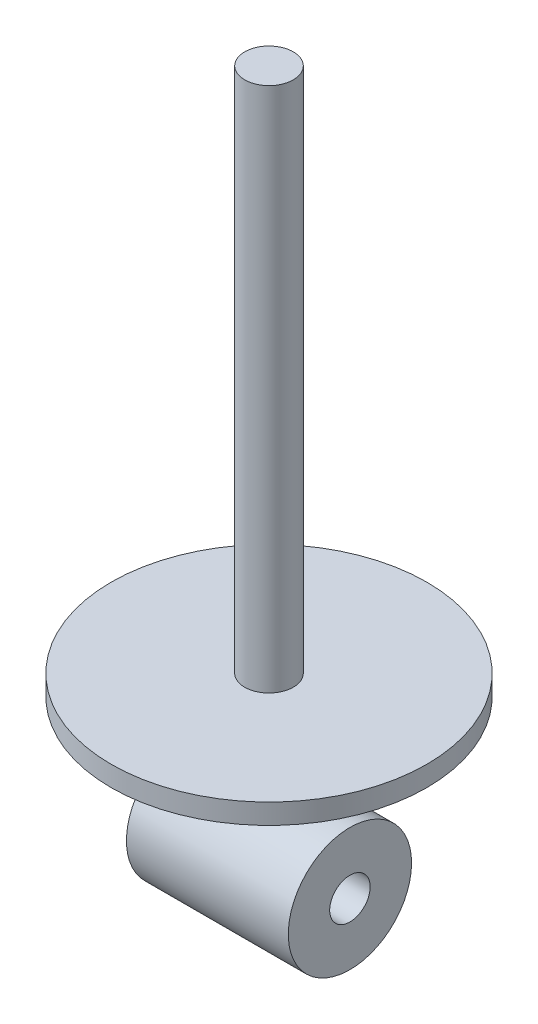
ISO-10303-21;
HEADER;
FILE_DESCRIPTION(('STEP AP214'),'2;1');
FILE_NAME('part.step','',(''),(''),'','','');
FILE_SCHEMA(('AUTOMOTIVE_DESIGN { 1 0 10303 214 1 1 1 1 }'));
ENDSEC;
DATA;
#1=APPLICATION_CONTEXT('core data for automotive mechanical design processes');
#2=APPLICATION_PROTOCOL_DEFINITION('international standard','automotive_design',2000,#1);
#3=PRODUCT_CONTEXT('',#1,'mechanical');
#4=PRODUCT('Part','Part','',(#3));
#5=PRODUCT_RELATED_PRODUCT_CATEGORY('part','',(#4));
#6=PRODUCT_DEFINITION_FORMATION('','',#4);
#7=PRODUCT_DEFINITION_CONTEXT('part definition',#1,'design');
#8=PRODUCT_DEFINITION('design','',#6,#7);
#9=PRODUCT_DEFINITION_SHAPE('','',#8);
#10=(LENGTH_UNIT() NAMED_UNIT(*) SI_UNIT(.MILLI.,.METRE.));
#11=(NAMED_UNIT(*) PLANE_ANGLE_UNIT() SI_UNIT($,.RADIAN.));
#12=(NAMED_UNIT(*) SI_UNIT($,.STERADIAN.) SOLID_ANGLE_UNIT());
#13=UNCERTAINTY_MEASURE_WITH_UNIT(LENGTH_MEASURE(1.E-05),#10,'distance_accuracy_value','');
#14=(GEOMETRIC_REPRESENTATION_CONTEXT(3) GLOBAL_UNCERTAINTY_ASSIGNED_CONTEXT((#13)) GLOBAL_UNIT_ASSIGNED_CONTEXT((#10,
#11,#12)) REPRESENTATION_CONTEXT('',''));
#15=CARTESIAN_POINT('',(0.,0.,0.));
#16=DIRECTION('',(0.,0.,1.));
#17=DIRECTION('',(1.,0.,0.));
#18=AXIS2_PLACEMENT_3D('',#15,#16,#17);
#19=CARTESIAN_POINT('',(0.,-20.,0.));
#20=DIRECTION('',(0.,1.,0.));
#21=DIRECTION('',(0.,0.,1.));
#22=AXIS2_PLACEMENT_3D('',#19,#20,#21);
#23=CYLINDRICAL_SURFACE('',#22,7.5);
#24=CARTESIAN_POINT('',(0.,0.,0.));
#25=DIRECTION('',(0.,-1.,0.));
#26=DIRECTION('',(0.,0.,-1.));
#27=AXIS2_PLACEMENT_3D('',#24,#25,#26);
#28=CIRCLE('',#27,7.5);
#29=CARTESIAN_POINT('',(0.,0.,-7.5));
#30=VERTEX_POINT('',#29);
#31=EDGE_CURVE('E43',#30,#30,#28,.T.);
#32=ORIENTED_EDGE('',*,*,#31,.T.);
#33=EDGE_LOOP('',(#32));
#34=FACE_BOUND('',#33,.T.);
#35=CARTESIAN_POINT('',(0.,-19.9674695696667,7.5));
#36=CARTESIAN_POINT('',(-0.195959488516597,-19.9674681956118,7.49999893072575));
#37=CARTESIAN_POINT('',(-0.391941529981052,-19.9631104142098,7.49230957299577));
#38=CARTESIAN_POINT('',(-0.782404371091417,-19.9458386103406,7.46165016093993));
#39=CARTESIAN_POINT('',(-0.976884396822196,-19.9329204405729,7.43867269987691));
#40=CARTESIAN_POINT('',(-1.36307668322194,-19.8989793225105,7.37768927740854));
#41=CARTESIAN_POINT('',(-1.55478391315212,-19.8779431916632,7.33965886930959));
#42=CARTESIAN_POINT('',(-1.93382272233385,-19.8285066309616,7.24902248845647));
#43=CARTESIAN_POINT('',(-2.1211523675893,-19.8001030108163,7.19641020073815));
#44=CARTESIAN_POINT('',(-2.48913675807943,-19.7370587431624,7.07752532784616));
#45=CARTESIAN_POINT('',(-2.66982334130422,-19.7024543925643,7.01133193106757));
#46=CARTESIAN_POINT('',(-3.02468502130675,-19.6279530734112,6.86572015291843));
#47=CARTESIAN_POINT('',(-3.19885757029247,-19.5880540611739,6.78629666183675));
#48=CARTESIAN_POINT('',(-3.71015035920553,-19.4621188934473,6.52917415078872));
#49=CARTESIAN_POINT('',(-4.03640461959471,-19.3697794798383,6.33250592799593));
#50=CARTESIAN_POINT('',(-4.67854646411312,-19.1698287921517,5.87612163776818));
#51=CARTESIAN_POINT('',(-4.99152677683117,-19.061586824195,5.61262552171513));
#52=CARTESIAN_POINT('',(-5.57125994245701,-18.8470586085634,5.03761092959794));
#53=CARTESIAN_POINT('',(-5.83799032588857,-18.7407733337906,4.72606924978246));
#54=CARTESIAN_POINT('',(-6.20617657602265,-18.5873368864239,4.21677792730242));
#55=CARTESIAN_POINT('',(-6.32665063135823,-18.5357468883586,4.03381863837286));
#56=CARTESIAN_POINT('',(-6.551612830314,-18.4374725970101,3.65710655068989));
#57=CARTESIAN_POINT('',(-6.65610776704691,-18.3907862217355,3.46335838660571));
#58=CARTESIAN_POINT('',(-6.84808769163061,-18.3036669933262,3.06632039776231));
#59=CARTESIAN_POINT('',(-6.93557661237472,-18.2632326947495,2.8630327926729));
#60=CARTESIAN_POINT('',(-7.09258844142189,-18.1898132070373,2.44833098959291));
#61=CARTESIAN_POINT('',(-7.16211319062356,-18.156827254668,2.23691762685113));
#62=CARTESIAN_POINT('',(-7.27813893374265,-18.1013269234205,1.82255972700864));
#63=CARTESIAN_POINT('',(-7.32590193859697,-18.0782451220556,1.62004416601229));
#64=CARTESIAN_POINT('',(-7.40451326762667,-18.0400719207078,1.21101002863962));
#65=CARTESIAN_POINT('',(-7.43536230852833,-18.0249801821482,1.00449162226721));
#66=CARTESIAN_POINT('',(-7.47972905846228,-18.0032303247073,0.589261661161209));
#67=CARTESIAN_POINT('',(-7.49325530052647,-17.9965680535768,0.380551237315101));
#68=CARTESIAN_POINT('',(-7.50281822420543,-17.9918608917265,-0.0373620159152723));
#69=CARTESIAN_POINT('',(-7.4988559335209,-17.9938154946426,-0.246564815643368));
#70=CARTESIAN_POINT('',(-7.47457695831722,-18.0057518946609,-0.645970016747518));
#71=CARTESIAN_POINT('',(-7.45567368847494,-18.015039878002,-0.836281132552197));
#72=CARTESIAN_POINT('',(-7.4034730158744,-18.040557210236,-1.21451364537474));
#73=CARTESIAN_POINT('',(-7.37017072760732,-18.056788915076,-1.40243420899372));
#74=CARTESIAN_POINT('',(-7.2895447624168,-18.0957966739858,-1.77447336873489));
#75=CARTESIAN_POINT('',(-7.24222597146092,-18.1185704474936,-1.95859326583505));
#76=CARTESIAN_POINT('',(-7.13402106128854,-18.1701406822553,-2.32200497076125));
#77=CARTESIAN_POINT('',(-7.07312966840532,-18.1989394842807,-2.501294871447));
#78=CARTESIAN_POINT('',(-6.93741889320247,-18.2623399800238,-2.8563665148068));
#79=CARTESIAN_POINT('',(-6.86241982332066,-18.2970158919497,-3.03206633666758));
#80=CARTESIAN_POINT('',(-6.69969109979067,-18.3711109915247,-3.37645512553365));
#81=CARTESIAN_POINT('',(-6.611957153821,-18.4105317776774,-3.54514170394868));
#82=CARTESIAN_POINT('',(-6.33065096317444,-18.5346441672733,-4.03936066947233));
#83=CARTESIAN_POINT('',(-6.11889321585113,-18.6252249308602,-4.35326276278946));
#84=CARTESIAN_POINT('',(-5.63052082753867,-18.8233598416666,-4.97156908252025));
#85=CARTESIAN_POINT('',(-5.34972182814521,-18.9317089682993,-5.27241694922315));
#86=CARTESIAN_POINT('',(-4.89467506787635,-19.0935711135136,-5.68632871200502));
#87=CARTESIAN_POINT('',(-4.73722527390899,-19.1474536388179,-5.81815442802291));
#88=CARTESIAN_POINT('',(-4.41164184708316,-19.2536401077985,-6.06873879072056));
#89=CARTESIAN_POINT('',(-4.24350658026791,-19.3059438082382,-6.18749543133689));
#90=CARTESIAN_POINT('',(-3.88690859668136,-19.4105964124893,-6.41792029200839));
#91=CARTESIAN_POINT('',(-3.69783148657889,-19.462756515314,-6.52872467229351));
#92=CARTESIAN_POINT('',(-3.30971221195444,-19.5619133586782,-6.73379135339735));
#93=CARTESIAN_POINT('',(-3.1106745886394,-19.6089124215799,-6.82806110595921));
#94=CARTESIAN_POINT('',(-2.70389218657615,-19.6960344406367,-6.99911551253198));
#95=CARTESIAN_POINT('',(-2.49615247117678,-19.7361613280879,-7.0759101716644));
#96=CARTESIAN_POINT('',(-2.07335818865409,-19.807955179108,-7.21113194120093));
#97=CARTESIAN_POINT('',(-1.85830459091507,-19.8396232589219,-7.26956147529183));
#98=CARTESIAN_POINT('',(-1.43975470254788,-19.8910176160774,-7.36338457580389));
#99=CARTESIAN_POINT('',(-1.23667347130844,-19.9114852644572,-7.40022459084145));
#100=CARTESIAN_POINT('',(-0.827453835065234,-19.9432407354115,-7.4570759198277));
#101=CARTESIAN_POINT('',(-0.621315600032058,-19.9545290664254,-7.47708816586335));
#102=CARTESIAN_POINT('',(-0.2079034193501,-19.9674483935546,-7.49997415721124));
#103=CARTESIAN_POINT('',(-0.000630179721547702,-19.9690848321654,-7.50285756111736));
#104=CARTESIAN_POINT('',(0.413284441879863,-19.9626437874801,-7.49146524655848));
#105=CARTESIAN_POINT('',(0.619925862672671,-19.9545669135184,-7.47719060444982));
#106=CARTESIAN_POINT('',(1.00918052315101,-19.9303866975527,-7.43409633943083));
#107=CARTESIAN_POINT('',(1.19204146882097,-19.915213689625,-7.40695862429943));
#108=CARTESIAN_POINT('',(1.55463050173951,-19.8778581388007,-7.33942374862377));
#109=CARTESIAN_POINT('',(1.73435752746831,-19.8556732677115,-7.29902218382795));
#110=CARTESIAN_POINT('',(2.08948958891867,-19.8049886355025,-7.2053975988397));
#111=CARTESIAN_POINT('',(2.26489522629603,-19.77648975905,-7.15217637474286));
#112=CARTESIAN_POINT('',(2.61053199258198,-19.7139922201265,-7.03338704168181));
#113=CARTESIAN_POINT('',(2.78076107516205,-19.6799914154329,-6.96781412184138));
#114=CARTESIAN_POINT('',(3.12286837563126,-19.6057417405347,-6.8215741682969));
#115=CARTESIAN_POINT('',(3.29446202524694,-19.5652773552139,-6.74035141299523));
#116=CARTESIAN_POINT('',(3.63030049193001,-19.480425093679,-6.56557448818588));
#117=CARTESIAN_POINT('',(3.79454281127617,-19.4360358989687,-6.47201616945798));
#118=CARTESIAN_POINT('',(4.11498561792895,-19.3444455239907,-6.27315389728714));
#119=CARTESIAN_POINT('',(4.27118408699686,-19.2972436443542,-6.16784701686065));
#120=CARTESIAN_POINT('',(4.57489215279109,-19.2011372044717,-5.9460679225991));
#121=CARTESIAN_POINT('',(4.72240118917157,-19.1522325347426,-5.82959498998087));
#122=CARTESIAN_POINT('',(5.02555781614664,-19.0478007494323,-5.57118642930856));
#123=CARTESIAN_POINT('',(5.18000942779679,-18.9921923274616,-5.4278772362373));
#124=CARTESIAN_POINT('',(5.47639265904589,-18.8816785294055,-5.12868918308842));
#125=CARTESIAN_POINT('',(5.61832770131432,-18.8267729646556,-4.97281378171076));
#126=CARTESIAN_POINT('',(5.88899461469242,-18.7190270600107,-4.64911602124094));
#127=CARTESIAN_POINT('',(6.01771710067819,-18.6661882044027,-4.48128531146784));
#128=CARTESIAN_POINT('',(6.26091363476485,-18.564003212003,-4.13470141510134));
#129=CARTESIAN_POINT('',(6.37539374900087,-18.5146555921079,-3.95595292732788));
#130=CARTESIAN_POINT('',(6.59182903969911,-18.4195935214359,-3.58401782360261));
#131=CARTESIAN_POINT('',(6.69341732786786,-18.3739948072718,-3.39058753824815));
#132=CARTESIAN_POINT('',(6.87972433502895,-18.2891077630608,-2.99453778666644));
#133=CARTESIAN_POINT('',(6.96445096344103,-18.2498164760242,-2.79192268385004));
#134=CARTESIAN_POINT('',(7.11610230287494,-18.1786966264476,-2.37895922865267));
#135=CARTESIAN_POINT('',(7.1830349263138,-18.1468647476994,-2.1686143609682));
#136=CARTESIAN_POINT('',(7.2982837263252,-18.091628169631,-1.74180890055136));
#137=CARTESIAN_POINT('',(7.34660202803596,-18.0682225083361,-1.5253490089823));
#138=CARTESIAN_POINT('',(7.42046797801752,-18.0322783299033,-1.10790761235387));
#139=CARTESIAN_POINT('',(7.44767331558711,-18.018951493364,-0.9072858917167));
#140=CARTESIAN_POINT('',(7.485775522034,-18.0002554452289,-0.504133895308034));
#141=CARTESIAN_POINT('',(7.49667340818462,-17.9948857372605,-0.301603739379631));
#142=CARTESIAN_POINT('',(7.50202057621287,-17.9922532092904,0.103667476696854));
#143=CARTESIAN_POINT('',(7.496474477459,-17.9949881125785,0.306408461624981));
#144=CARTESIAN_POINT('',(7.4690153395823,-18.0084839330424,0.710505761006883));
#145=CARTESIAN_POINT('',(7.44710270705817,-18.0192446508304,0.911862109734177));
#146=CARTESIAN_POINT('',(7.38907808715899,-18.047572318408,1.29899747410635));
#147=CARTESIAN_POINT('',(7.35394663725788,-18.0646682442261,1.48495925120658));
#148=CARTESIAN_POINT('',(7.26991634219004,-18.1052470009027,1.85309880136019));
#149=CARTESIAN_POINT('',(7.22101278718317,-18.1287320166344,2.03527525696805));
#150=CARTESIAN_POINT('',(7.10993932095547,-18.1815403214913,2.39460190608344));
#151=CARTESIAN_POINT('',(7.0477732335916,-18.2108619276462,2.57175353170719));
#152=CARTESIAN_POINT('',(6.91069843846917,-18.2747097554421,2.92015584394));
#153=CARTESIAN_POINT('',(6.83578477401463,-18.3092380010067,3.09140420388914));
#154=CARTESIAN_POINT('',(6.67032432250445,-18.3843469397423,3.43432037055363));
#155=CARTESIAN_POINT('',(6.57924216566048,-18.4251246022783,3.60568698015964));
#156=CARTESIAN_POINT('',(6.38456402372372,-18.5106251307253,3.94015486183616));
#157=CARTESIAN_POINT('',(6.28096376849411,-18.55534934146,4.1032532864033));
#158=CARTESIAN_POINT('',(5.95242698146223,-18.693992962699,4.57898039041257));
#159=CARTESIAN_POINT('',(5.70967280494205,-18.792421630823,4.87820888648465));
#160=CARTESIAN_POINT('',(5.15638305069094,-19.0026238957802,5.46249751784339));
#161=CARTESIAN_POINT('',(4.84156063521963,-19.114766909179,5.74338140047681));
#162=CARTESIAN_POINT('',(4.33638723073197,-19.2772807723366,6.12292919079121));
#163=CARTESIAN_POINT('',(4.16234944710806,-19.3305433931665,6.24256324939306));
#164=CARTESIAN_POINT('',(3.80398956527041,-19.433646538708,6.46717485691149));
#165=CARTESIAN_POINT('',(3.61966609460044,-19.483486604747,6.57215044331874));
#166=CARTESIAN_POINT('',(3.23657084618856,-19.5794498310631,6.76921565714714));
#167=CARTESIAN_POINT('',(3.03754149088305,-19.6254336164213,6.8608730689675));
#168=CARTESIAN_POINT('',(2.6310194303109,-19.7104097707477,7.02679833811711));
#169=CARTESIAN_POINT('',(2.42353114098697,-19.7494057317282,7.10107513579505));
#170=CARTESIAN_POINT('',(2.00204795283096,-19.8187782709798,7.23120486458602));
#171=CARTESIAN_POINT('',(1.78807146351623,-19.8491770955361,7.2871054088867));
#172=CARTESIAN_POINT('',(1.35500079215342,-19.9001439471935,7.37990167718108));
#173=CARTESIAN_POINT('',(1.13591034161994,-19.9207189209394,7.41681083181165));
#174=CARTESIAN_POINT('',(0.763730246772357,-19.9463545584962,7.46257711801338));
#175=CARTESIAN_POINT('',(0.611448321385194,-19.9542555620024,7.47659871182316));
#176=CARTESIAN_POINT('',(0.306115549903041,-19.9648137728699,7.49531087051307));
#177=CARTESIAN_POINT('',(0.153064654985126,-19.9674706429459,7.50000083521392));
#178=CARTESIAN_POINT('',(0.,-19.9674695696667,7.5));
#179=B_SPLINE_CURVE_WITH_KNOTS('',3,(#35,#36,#37,#38,#39,#40,#41,#42,#43,#44,#45,#46,#47,#48,
#49,#50,#51,#52,#53,#54,#55,#56,#57,#58,#59,#60,#61,#62,#63,#64,#65,#66,#67,#68,#69,#70,#71,#72,
#73,#74,#75,#76,#77,#78,#79,#80,#81,#82,#83,#84,#85,#86,#87,#88,#89,#90,#91,#92,#93,#94,#95,#96,
#97,#98,#99,#100,#101,#102,#103,#104,#105,#106,#107,#108,#109,#110,#111,#112,#113,#114,#115,
#116,#117,#118,#119,#120,#121,#122,#123,#124,#125,#126,#127,#128,#129,#130,#131,#132,#133,#134,
#135,#136,#137,#138,#139,#140,#141,#142,#143,#144,#145,#146,#147,#148,#149,#150,#151,#152,#153,
#154,#155,#156,#157,#158,#159,#160,#161,#162,#163,#164,#165,#166,#167,#168,#169,#170,#171,#172,
#173,#174,#175,#176,#177,#178),.UNSPECIFIED.,.T.,.F.,(4,2,2,2,2,2,2,2,2,2,2,2,2,2,2,2,2,2,2,2,2,
2,2,2,2,2,2,2,2,2,2,2,2,2,2,2,2,2,2,2,2,2,2,2,2,2,2,2,2,2,2,2,2,2,2,2,2,2,2,2,2,2,2,2,2,2,2,2,2,
2,2,4),(0.,0.587720242828634,1.17572543023581,1.764689509921,2.35390905147922,2.93978593776309,
3.52588962759382,4.69696040061909,5.96152782309899,7.2267078959606,7.90113869940246,
8.57528198396913,9.24926917693006,9.92318727488115,10.5503848948872,11.1775559354489,
11.8044179190523,12.4312430660652,13.0049845287862,13.5789208118207,14.1526572632222,
14.7266170310954,15.3084542263886,15.8904879886947,17.0538761821741,18.3247396608158,
18.9610926420081,19.5975431656106,20.2725081793674,20.9471682172729,21.6214410106218,
22.2956247812771,22.9169734661126,23.5382877322934,24.159251619144,24.7801765538008,
25.3359997061302,25.8920076061148,26.4479376519969,27.004084677126,27.5858233448907,
28.1677581892774,28.7498383394087,29.3319559845019,29.9849529956729,30.6377708867876,
31.2910493234534,31.9440485550788,32.6127324223316,33.2811018820735,33.9491736405872,
34.6171691048431,35.2250588013917,35.8329105756596,36.440591611187,37.048257550414,
37.617676120294,38.1872896592053,38.7567391884021,39.3264106472311,39.9206810798242,
40.5151548035376,41.7035364888114,43.0069685609389,43.6597589668989,44.312636686288,
44.9834147731906,45.6538470588473,46.3225282941427,46.9907359884707,47.4497768420706,
47.9088472186945),.UNSPECIFIED.);
#180=CARTESIAN_POINT('',(0.,-19.9674695696667,7.5));
#181=VERTEX_POINT('',#180);
#182=EDGE_CURVE('E10',#181,#181,#179,.T.);
#183=ORIENTED_EDGE('',*,*,#182,.F.);
#184=EDGE_LOOP('',(#183));
#185=FACE_BOUND('',#184,.T.);
#186=ADVANCED_FACE('F32',(#34,#185),#23,.T.);
#187=CARTESIAN_POINT('',(0.,5.,0.));
#188=DIRECTION('',(0.,-1.,0.));
#189=DIRECTION('',(0.,0.,-1.));
#190=AXIS2_PLACEMENT_3D('',#187,#188,#189);
#191=CYLINDRICAL_SURFACE('',#190,39.);
#192=CARTESIAN_POINT('',(0.,5.,0.));
#193=DIRECTION('',(0.,1.,0.));
#194=DIRECTION('',(0.,0.,1.));
#195=AXIS2_PLACEMENT_3D('',#192,#193,#194);
#196=CIRCLE('',#195,39.);
#197=CARTESIAN_POINT('',(0.,5.,39.));
#198=VERTEX_POINT('',#197);
#199=EDGE_CURVE('E52',#198,#198,#196,.T.);
#200=ORIENTED_EDGE('',*,*,#199,.F.);
#201=EDGE_LOOP('',(#200));
#202=FACE_BOUND('',#201,.T.);
#203=CARTESIAN_POINT('',(0.,0.,0.));
#204=DIRECTION('',(0.,1.,0.));
#205=DIRECTION('',(0.,0.,1.));
#206=AXIS2_PLACEMENT_3D('',#203,#204,#205);
#207=CIRCLE('',#206,39.);
#208=CARTESIAN_POINT('',(0.,0.,39.));
#209=VERTEX_POINT('',#208);
#210=EDGE_CURVE('E60',#209,#209,#207,.T.);
#211=ORIENTED_EDGE('',*,*,#210,.T.);
#212=EDGE_LOOP('',(#211));
#213=FACE_BOUND('',#212,.T.);
#214=ADVANCED_FACE('F34',(#202,#213),#191,.T.);
#215=CARTESIAN_POINT('',(0.,5.,0.));
#216=DIRECTION('',(0.,1.,0.));
#217=DIRECTION('',(0.,0.,1.));
#218=AXIS2_PLACEMENT_3D('',#215,#216,#217);
#219=PLANE('',#218);
#220=CARTESIAN_POINT('',(0.,5.,0.));
#221=DIRECTION('',(0.,1.,0.));
#222=DIRECTION('',(0.,0.,1.));
#223=AXIS2_PLACEMENT_3D('',#220,#221,#222);
#224=CIRCLE('',#223,6.);
#225=CARTESIAN_POINT('',(0.,5.,6.));
#226=VERTEX_POINT('',#225);
#227=EDGE_CURVE('E47',#226,#226,#224,.T.);
#228=ORIENTED_EDGE('',*,*,#227,.F.);
#229=EDGE_LOOP('',(#228));
#230=FACE_BOUND('',#229,.T.);
#231=ORIENTED_EDGE('',*,*,#199,.T.);
#232=EDGE_LOOP('',(#231));
#233=FACE_BOUND('',#232,.T.);
#234=ADVANCED_FACE('F71',(#230,#233),#219,.T.);
#235=CARTESIAN_POINT('',(0.,0.,0.));
#236=DIRECTION('',(0.,1.,0.));
#237=DIRECTION('',(0.,0.,1.));
#238=AXIS2_PLACEMENT_3D('',#235,#236,#237);
#239=PLANE('',#238);
#240=ORIENTED_EDGE('',*,*,#31,.F.);
#241=EDGE_LOOP('',(#240));
#242=FACE_BOUND('',#241,.T.);
#243=ORIENTED_EDGE('',*,*,#210,.F.);
#244=EDGE_LOOP('',(#243));
#245=FACE_BOUND('',#244,.T.);
#246=ADVANCED_FACE('F68',(#242,#245),#239,.F.);
#247=CARTESIAN_POINT('',(0.,135.,0.));
#248=DIRECTION('',(0.,-1.,0.));
#249=DIRECTION('',(0.,0.,-1.));
#250=AXIS2_PLACEMENT_3D('',#247,#248,#249);
#251=CYLINDRICAL_SURFACE('',#250,6.);
#252=CARTESIAN_POINT('',(0.,135.,0.));
#253=DIRECTION('',(0.,1.,0.));
#254=DIRECTION('',(0.,0.,1.));
#255=AXIS2_PLACEMENT_3D('',#252,#253,#254);
#256=CIRCLE('',#255,6.);
#257=CARTESIAN_POINT('',(0.,135.,6.));
#258=VERTEX_POINT('',#257);
#259=EDGE_CURVE('E58',#258,#258,#256,.T.);
#260=ORIENTED_EDGE('',*,*,#259,.F.);
#261=EDGE_LOOP('',(#260));
#262=FACE_BOUND('',#261,.T.);
#263=ORIENTED_EDGE('',*,*,#227,.T.);
#264=EDGE_LOOP('',(#263));
#265=FACE_BOUND('',#264,.T.);
#266=ADVANCED_FACE('F70',(#262,#265),#251,.T.);
#267=CARTESIAN_POINT('',(0.,135.,0.));
#268=DIRECTION('',(0.,1.,0.));
#269=DIRECTION('',(0.,0.,1.));
#270=AXIS2_PLACEMENT_3D('',#267,#268,#269);
#271=PLANE('',#270);
#272=ORIENTED_EDGE('',*,*,#259,.T.);
#273=EDGE_LOOP('',(#272));
#274=FACE_BOUND('',#273,.T.);
#275=ADVANCED_FACE('F77',(#274),#271,.T.);
#276=CARTESIAN_POINT('',(20.,-33.226479945751,0.));
#277=DIRECTION('',(-1.,0.,0.));
#278=DIRECTION('',(0.,0.,1.));
#279=AXIS2_PLACEMENT_3D('',#276,#277,#278);
#280=CYLINDRICAL_SURFACE('',#279,15.2332319667597);
#281=CARTESIAN_POINT('',(-20.,-33.226479945751,0.));
#282=DIRECTION('',(1.,0.,0.));
#283=DIRECTION('',(0.,0.,-1.));
#284=AXIS2_PLACEMENT_3D('',#281,#282,#283);
#285=CIRCLE('',#284,15.2332319667597);
#286=CARTESIAN_POINT('',(-20.,-33.226479945751,-15.2332319667597));
#287=VERTEX_POINT('',#286);
#288=EDGE_CURVE('E56',#287,#287,#285,.T.);
#289=ORIENTED_EDGE('',*,*,#288,.T.);
#290=EDGE_LOOP('',(#289));
#291=FACE_BOUND('',#290,.T.);
#292=CARTESIAN_POINT('',(20.,-33.226479945751,0.));
#293=DIRECTION('',(1.,0.,0.));
#294=DIRECTION('',(0.,0.,-1.));
#295=AXIS2_PLACEMENT_3D('',#292,#293,#294);
#296=CIRCLE('',#295,15.2332319667597);
#297=CARTESIAN_POINT('',(20.,-33.226479945751,-15.2332319667597));
#298=VERTEX_POINT('',#297);
#299=EDGE_CURVE('E61',#298,#298,#296,.T.);
#300=ORIENTED_EDGE('',*,*,#299,.F.);
#301=EDGE_LOOP('',(#300));
#302=FACE_BOUND('',#301,.T.);
#303=ORIENTED_EDGE('',*,*,#182,.T.);
#304=EDGE_LOOP('',(#303));
#305=FACE_BOUND('',#304,.T.);
#306=ADVANCED_FACE('F90',(#291,#302,#305),#280,.T.);
#307=CARTESIAN_POINT('',(20.,-33.226479945751,0.));
#308=DIRECTION('',(1.,0.,0.));
#309=DIRECTION('',(0.,0.,-1.));
#310=AXIS2_PLACEMENT_3D('',#307,#308,#309);
#311=PLANE('',#310);
#312=ORIENTED_EDGE('',*,*,#299,.T.);
#313=EDGE_LOOP('',(#312));
#314=FACE_BOUND('',#313,.T.);
#315=CARTESIAN_POINT('',(20.,-33.226479945751,0.));
#316=DIRECTION('',(1.,0.,0.));
#317=DIRECTION('',(0.,0.,-1.));
#318=AXIS2_PLACEMENT_3D('',#315,#316,#317);
#319=CIRCLE('',#318,5.);
#320=CARTESIAN_POINT('',(20.,-33.226479945751,-5.));
#321=VERTEX_POINT('',#320);
#322=EDGE_CURVE('E116',#321,#321,#319,.T.);
#323=ORIENTED_EDGE('',*,*,#322,.F.);
#324=EDGE_LOOP('',(#323));
#325=FACE_BOUND('',#324,.T.);
#326=ADVANCED_FACE('F98',(#314,#325),#311,.T.);
#327=CARTESIAN_POINT('',(-20.,-33.226479945751,0.));
#328=DIRECTION('',(1.,0.,0.));
#329=DIRECTION('',(0.,0.,-1.));
#330=AXIS2_PLACEMENT_3D('',#327,#328,#329);
#331=PLANE('',#330);
#332=ORIENTED_EDGE('',*,*,#288,.F.);
#333=EDGE_LOOP('',(#332));
#334=FACE_BOUND('',#333,.T.);
#335=CARTESIAN_POINT('',(-20.,-33.226479945751,0.));
#336=DIRECTION('',(1.,0.,0.));
#337=DIRECTION('',(0.,0.,-1.));
#338=AXIS2_PLACEMENT_3D('',#335,#336,#337);
#339=CIRCLE('',#338,5.);
#340=CARTESIAN_POINT('',(-20.,-33.226479945751,-5.));
#341=VERTEX_POINT('',#340);
#342=EDGE_CURVE('E118',#341,#341,#339,.T.);
#343=ORIENTED_EDGE('',*,*,#342,.T.);
#344=EDGE_LOOP('',(#343));
#345=FACE_BOUND('',#344,.T.);
#346=ADVANCED_FACE('F108',(#334,#345),#331,.F.);
#347=CARTESIAN_POINT('',(20.,-33.226479945751,0.));
#348=DIRECTION('',(-1.,0.,0.));
#349=DIRECTION('',(0.,0.,1.));
#350=AXIS2_PLACEMENT_3D('',#347,#348,#349);
#351=CYLINDRICAL_SURFACE('',#350,5.);
#352=ORIENTED_EDGE('',*,*,#322,.T.);
#353=EDGE_LOOP('',(#352));
#354=FACE_BOUND('',#353,.T.);
#355=ORIENTED_EDGE('',*,*,#342,.F.);
#356=EDGE_LOOP('',(#355));
#357=FACE_BOUND('',#356,.T.);
#358=ADVANCED_FACE('F124',(#354,#357),#351,.F.);
#359=CLOSED_SHELL('',(#186,#214,#234,#246,#266,#275,#306,#326,#346,#358));
#360=MANIFOLD_SOLID_BREP('B2',#359);
#361=ADVANCED_BREP_SHAPE_REPRESENTATION('',(#18,#360),#14);
#362=SHAPE_DEFINITION_REPRESENTATION(#9,#361);
ENDSEC;
END-ISO-10303-21;
